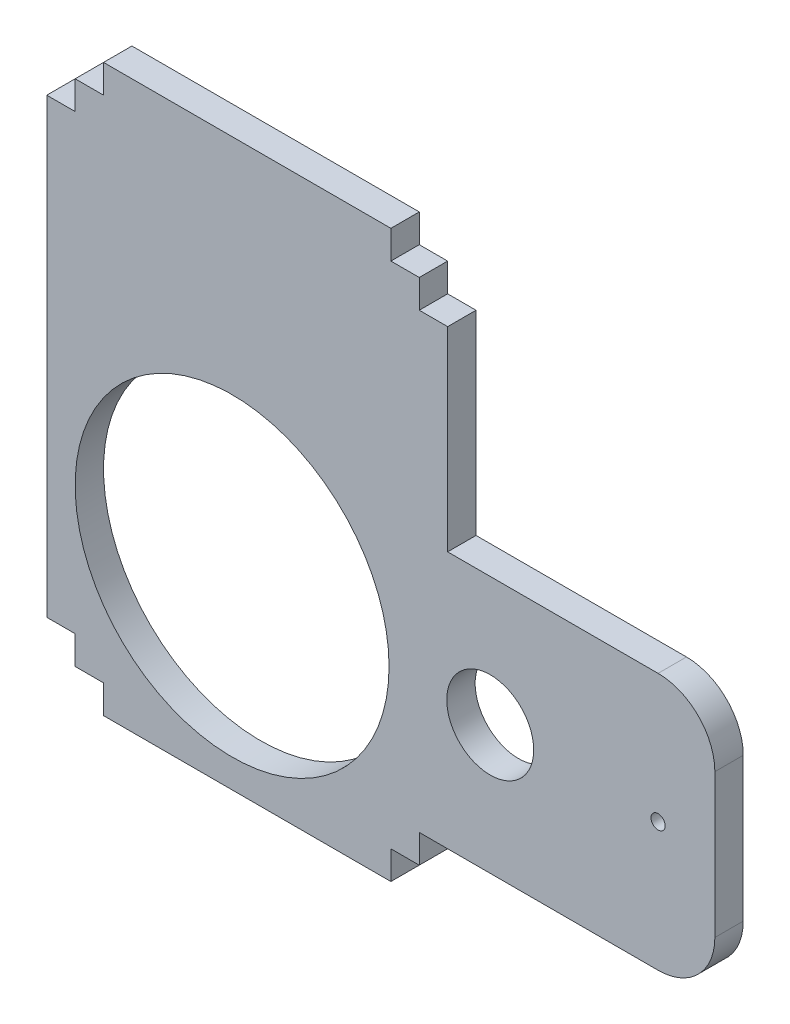
ISO-10303-21;
HEADER;
FILE_DESCRIPTION(('STEP AP214'),'2;1');
FILE_NAME('part.step','',(''),(''),'','','');
FILE_SCHEMA(('AUTOMOTIVE_DESIGN { 1 0 10303 214 1 1 1 1 }'));
ENDSEC;
DATA;
#1=APPLICATION_CONTEXT('core data for automotive mechanical design processes');
#2=APPLICATION_PROTOCOL_DEFINITION('international standard','automotive_design',2000,#1);
#3=PRODUCT_CONTEXT('',#1,'mechanical');
#4=PRODUCT('Part','Part','',(#3));
#5=PRODUCT_RELATED_PRODUCT_CATEGORY('part','',(#4));
#6=PRODUCT_DEFINITION_FORMATION('','',#4);
#7=PRODUCT_DEFINITION_CONTEXT('part definition',#1,'design');
#8=PRODUCT_DEFINITION('design','',#6,#7);
#9=PRODUCT_DEFINITION_SHAPE('','',#8);
#10=(LENGTH_UNIT() NAMED_UNIT(*) SI_UNIT(.MILLI.,.METRE.));
#11=(NAMED_UNIT(*) PLANE_ANGLE_UNIT() SI_UNIT($,.RADIAN.));
#12=(NAMED_UNIT(*) SI_UNIT($,.STERADIAN.) SOLID_ANGLE_UNIT());
#13=UNCERTAINTY_MEASURE_WITH_UNIT(LENGTH_MEASURE(1.E-05),#10,'distance_accuracy_value','');
#14=(GEOMETRIC_REPRESENTATION_CONTEXT(3) GLOBAL_UNCERTAINTY_ASSIGNED_CONTEXT((#13)) GLOBAL_UNIT_ASSIGNED_CONTEXT((#10,
#11,#12)) REPRESENTATION_CONTEXT('',''));
#15=CARTESIAN_POINT('',(0.,0.,0.));
#16=DIRECTION('',(0.,0.,1.));
#17=DIRECTION('',(1.,0.,0.));
#18=AXIS2_PLACEMENT_3D('',#15,#16,#17);
#19=CARTESIAN_POINT('',(-35.1155,-35.1155,-6.35));
#20=DIRECTION('',(-1.,0.,0.));
#21=DIRECTION('',(0.,0.,1.));
#22=AXIS2_PLACEMENT_3D('',#19,#20,#21);
#23=PLANE('',#22);
#24=DIRECTION('',(0.,-1.,0.));
#25=VECTOR('',#24,1.);
#26=CARTESIAN_POINT('',(-35.1155,-35.1155,0.));
#27=LINE('',#26,#25);
#28=CARTESIAN_POINT('',(-35.1155,-28.7655,0.));
#29=VERTEX_POINT('',#28);
#30=CARTESIAN_POINT('',(-35.1155,-35.1155,0.));
#31=VERTEX_POINT('',#30);
#32=EDGE_CURVE('E224',#29,#31,#27,.T.);
#33=ORIENTED_EDGE('',*,*,#32,.F.);
#34=DIRECTION('',(0.,0.,1.));
#35=VECTOR('',#34,1.);
#36=CARTESIAN_POINT('',(-35.1155,-28.7655,-6.35));
#37=LINE('',#36,#35);
#38=CARTESIAN_POINT('',(-35.1155,-28.7655,-6.35));
#39=VERTEX_POINT('',#38);
#40=EDGE_CURVE('E11',#39,#29,#37,.T.);
#41=ORIENTED_EDGE('',*,*,#40,.F.);
#42=DIRECTION('',(0.,-1.,0.));
#43=VECTOR('',#42,1.);
#44=CARTESIAN_POINT('',(-35.1155,-35.1155,-6.35));
#45=LINE('',#44,#43);
#46=CARTESIAN_POINT('',(-35.1155,-35.1155,-6.35));
#47=VERTEX_POINT('',#46);
#48=EDGE_CURVE('E293',#39,#47,#45,.T.);
#49=ORIENTED_EDGE('',*,*,#48,.T.);
#50=DIRECTION('',(0.,0.,1.));
#51=VECTOR('',#50,1.);
#52=CARTESIAN_POINT('',(-35.1155,-35.1155,-6.35));
#53=LINE('',#52,#51);
#54=EDGE_CURVE('E34',#47,#31,#53,.T.);
#55=ORIENTED_EDGE('',*,*,#54,.T.);
#56=EDGE_LOOP('',(#33,#41,#49,#55));
#57=FACE_BOUND('',#56,.T.);
#58=ADVANCED_FACE('F31',(#57),#23,.T.);
#59=CARTESIAN_POINT('',(-35.1155,-28.7655,-6.35));
#60=DIRECTION('',(0.,-1.,0.));
#61=DIRECTION('',(0.,0.,-1.));
#62=AXIS2_PLACEMENT_3D('',#59,#60,#61);
#63=PLANE('',#62);
#64=DIRECTION('',(1.,0.,0.));
#65=VECTOR('',#64,1.);
#66=CARTESIAN_POINT('',(-35.1155,-28.7655,0.));
#67=LINE('',#66,#65);
#68=CARTESIAN_POINT('',(-41.4655,-28.7655,0.));
#69=VERTEX_POINT('',#68);
#70=EDGE_CURVE('E291',#69,#29,#67,.T.);
#71=ORIENTED_EDGE('',*,*,#70,.F.);
#72=DIRECTION('',(0.,0.,1.));
#73=VECTOR('',#72,1.);
#74=CARTESIAN_POINT('',(-41.4655,-28.7655,-6.35));
#75=LINE('',#74,#73);
#76=CARTESIAN_POINT('',(-41.4655,-28.7655,-6.35));
#77=VERTEX_POINT('',#76);
#78=EDGE_CURVE('E40',#77,#69,#75,.T.);
#79=ORIENTED_EDGE('',*,*,#78,.F.);
#80=DIRECTION('',(1.,0.,0.));
#81=VECTOR('',#80,1.);
#82=CARTESIAN_POINT('',(-35.1155,-28.7655,-6.35));
#83=LINE('',#82,#81);
#84=EDGE_CURVE('E214',#77,#39,#83,.T.);
#85=ORIENTED_EDGE('',*,*,#84,.T.);
#86=ORIENTED_EDGE('',*,*,#40,.T.);
#87=EDGE_LOOP('',(#71,#79,#85,#86));
#88=FACE_BOUND('',#87,.T.);
#89=ADVANCED_FACE('F337',(#88),#63,.T.);
#90=CARTESIAN_POINT('',(-41.4655,-28.7655,-6.35));
#91=DIRECTION('',(-1.,0.,0.));
#92=DIRECTION('',(0.,0.,1.));
#93=AXIS2_PLACEMENT_3D('',#90,#91,#92);
#94=PLANE('',#93);
#95=DIRECTION('',(0.,-1.,0.));
#96=VECTOR('',#95,1.);
#97=CARTESIAN_POINT('',(-41.4655,-28.7655,0.));
#98=LINE('',#97,#96);
#99=CARTESIAN_POINT('',(-41.4655,72.4027,0.));
#100=VERTEX_POINT('',#99);
#101=EDGE_CURVE('E201',#100,#69,#98,.T.);
#102=ORIENTED_EDGE('',*,*,#101,.F.);
#103=DIRECTION('',(0.,0.,1.));
#104=VECTOR('',#103,1.);
#105=CARTESIAN_POINT('',(-41.4655,72.4027,-6.35));
#106=LINE('',#105,#104);
#107=CARTESIAN_POINT('',(-41.4655,72.4027,-6.35));
#108=VERTEX_POINT('',#107);
#109=EDGE_CURVE('E196',#108,#100,#106,.T.);
#110=ORIENTED_EDGE('',*,*,#109,.F.);
#111=DIRECTION('',(0.,-1.,0.));
#112=VECTOR('',#111,1.);
#113=CARTESIAN_POINT('',(-41.4655,-28.7655,-6.35));
#114=LINE('',#113,#112);
#115=EDGE_CURVE('E199',#108,#77,#114,.T.);
#116=ORIENTED_EDGE('',*,*,#115,.T.);
#117=ORIENTED_EDGE('',*,*,#78,.T.);
#118=EDGE_LOOP('',(#102,#110,#116,#117));
#119=FACE_BOUND('',#118,.T.);
#120=ADVANCED_FACE('F198',(#119),#94,.T.);
#121=CARTESIAN_POINT('',(-35.1155,72.4027,-6.35));
#122=DIRECTION('',(0.,1.,0.));
#123=DIRECTION('',(0.,0.,1.));
#124=AXIS2_PLACEMENT_3D('',#121,#122,#123);
#125=PLANE('',#124);
#126=DIRECTION('',(-1.,0.,0.));
#127=VECTOR('',#126,1.);
#128=CARTESIAN_POINT('',(-35.1155,72.4027,0.));
#129=LINE('',#128,#127);
#130=CARTESIAN_POINT('',(-35.1155,72.4027,0.));
#131=VERTEX_POINT('',#130);
#132=EDGE_CURVE('E288',#131,#100,#129,.T.);
#133=ORIENTED_EDGE('',*,*,#132,.F.);
#134=DIRECTION('',(0.,0.,1.));
#135=VECTOR('',#134,1.);
#136=CARTESIAN_POINT('',(-35.1155,72.4027,-6.35));
#137=LINE('',#136,#135);
#138=CARTESIAN_POINT('',(-35.1155,72.4027,-6.35));
#139=VERTEX_POINT('',#138);
#140=EDGE_CURVE('E206',#139,#131,#137,.T.);
#141=ORIENTED_EDGE('',*,*,#140,.F.);
#142=DIRECTION('',(-1.,0.,0.));
#143=VECTOR('',#142,1.);
#144=CARTESIAN_POINT('',(-35.1155,72.4027,-6.35));
#145=LINE('',#144,#143);
#146=EDGE_CURVE('E212',#139,#108,#145,.T.);
#147=ORIENTED_EDGE('',*,*,#146,.T.);
#148=ORIENTED_EDGE('',*,*,#109,.T.);
#149=EDGE_LOOP('',(#133,#141,#147,#148));
#150=FACE_BOUND('',#149,.T.);
#151=ADVANCED_FACE('F216',(#150),#125,.T.);
#152=CARTESIAN_POINT('',(-35.1155,72.4027,-6.35));
#153=DIRECTION('',(-1.,0.,0.));
#154=DIRECTION('',(0.,0.,1.));
#155=AXIS2_PLACEMENT_3D('',#152,#153,#154);
#156=PLANE('',#155);
#157=DIRECTION('',(0.,-1.,0.));
#158=VECTOR('',#157,1.);
#159=CARTESIAN_POINT('',(-35.1155,72.4027,0.));
#160=LINE('',#159,#158);
#161=CARTESIAN_POINT('',(-35.1155,78.7527,0.));
#162=VERTEX_POINT('',#161);
#163=EDGE_CURVE('E285',#162,#131,#160,.T.);
#164=ORIENTED_EDGE('',*,*,#163,.F.);
#165=DIRECTION('',(0.,0.,1.));
#166=VECTOR('',#165,1.);
#167=CARTESIAN_POINT('',(-35.1155,78.7527,-6.35));
#168=LINE('',#167,#166);
#169=CARTESIAN_POINT('',(-35.1155,78.7527,-6.35));
#170=VERTEX_POINT('',#169);
#171=EDGE_CURVE('E297',#170,#162,#168,.T.);
#172=ORIENTED_EDGE('',*,*,#171,.F.);
#173=DIRECTION('',(0.,-1.,0.));
#174=VECTOR('',#173,1.);
#175=CARTESIAN_POINT('',(-35.1155,72.4027,-6.35));
#176=LINE('',#175,#174);
#177=EDGE_CURVE('E217',#170,#139,#176,.T.);
#178=ORIENTED_EDGE('',*,*,#177,.T.);
#179=ORIENTED_EDGE('',*,*,#140,.T.);
#180=EDGE_LOOP('',(#164,#172,#178,#179));
#181=FACE_BOUND('',#180,.T.);
#182=ADVANCED_FACE('F350',(#181),#156,.T.);
#183=CARTESIAN_POINT('',(-35.1155,78.7527,-6.35));
#184=DIRECTION('',(0.,1.,0.));
#185=DIRECTION('',(-1.,0.,0.));
#186=AXIS2_PLACEMENT_3D('',#183,#184,#185);
#187=PLANE('',#186);
#188=DIRECTION('',(-1.,0.,0.));
#189=VECTOR('',#188,1.);
#190=CARTESIAN_POINT('',(-35.1155,78.7527,0.));
#191=LINE('',#190,#189);
#192=CARTESIAN_POINT('',(-28.7655,78.7527,0.));
#193=VERTEX_POINT('',#192);
#194=EDGE_CURVE('E282',#193,#162,#191,.T.);
#195=ORIENTED_EDGE('',*,*,#194,.F.);
#196=DIRECTION('',(0.,0.,1.));
#197=VECTOR('',#196,1.);
#198=CARTESIAN_POINT('',(-28.7655,78.7527,-6.35));
#199=LINE('',#198,#197);
#200=CARTESIAN_POINT('',(-28.7655,78.7527,-6.35));
#201=VERTEX_POINT('',#200);
#202=EDGE_CURVE('E299',#201,#193,#199,.T.);
#203=ORIENTED_EDGE('',*,*,#202,.F.);
#204=DIRECTION('',(-1.,0.,0.));
#205=VECTOR('',#204,1.);
#206=CARTESIAN_POINT('',(-35.1155,78.7527,-6.35));
#207=LINE('',#206,#205);
#208=EDGE_CURVE('E219',#201,#170,#207,.T.);
#209=ORIENTED_EDGE('',*,*,#208,.T.);
#210=ORIENTED_EDGE('',*,*,#171,.T.);
#211=EDGE_LOOP('',(#195,#203,#209,#210));
#212=FACE_BOUND('',#211,.T.);
#213=ADVANCED_FACE('F353',(#212),#187,.T.);
#214=CARTESIAN_POINT('',(-28.7655,78.7527,-6.35));
#215=DIRECTION('',(-1.,0.,0.));
#216=DIRECTION('',(0.,-1.,0.));
#217=AXIS2_PLACEMENT_3D('',#214,#215,#216);
#218=PLANE('',#217);
#219=DIRECTION('',(0.,-1.,0.));
#220=VECTOR('',#219,1.);
#221=CARTESIAN_POINT('',(-28.7655,78.7527,0.));
#222=LINE('',#221,#220);
#223=CARTESIAN_POINT('',(-28.7655,85.1027,0.));
#224=VERTEX_POINT('',#223);
#225=EDGE_CURVE('E279',#224,#193,#222,.T.);
#226=ORIENTED_EDGE('',*,*,#225,.F.);
#227=DIRECTION('',(0.,0.,1.));
#228=VECTOR('',#227,1.);
#229=CARTESIAN_POINT('',(-28.7655,85.1027,-6.35));
#230=LINE('',#229,#228);
#231=CARTESIAN_POINT('',(-28.7655,85.1027,-6.35));
#232=VERTEX_POINT('',#231);
#233=EDGE_CURVE('E301',#232,#224,#230,.T.);
#234=ORIENTED_EDGE('',*,*,#233,.F.);
#235=DIRECTION('',(0.,-1.,0.));
#236=VECTOR('',#235,1.);
#237=CARTESIAN_POINT('',(-28.7655,78.7527,-6.35));
#238=LINE('',#237,#236);
#239=EDGE_CURVE('E521',#232,#201,#238,.T.);
#240=ORIENTED_EDGE('',*,*,#239,.T.);
#241=ORIENTED_EDGE('',*,*,#202,.T.);
#242=EDGE_LOOP('',(#226,#234,#240,#241));
#243=FACE_BOUND('',#242,.T.);
#244=ADVANCED_FACE('F357',(#243),#218,.T.);
#245=CARTESIAN_POINT('',(35.5219,85.1027,-6.35));
#246=DIRECTION('',(0.,1.,0.));
#247=DIRECTION('',(-1.,0.,0.));
#248=AXIS2_PLACEMENT_3D('',#245,#246,#247);
#249=PLANE('',#248);
#250=DIRECTION('',(-1.,0.,0.));
#251=VECTOR('',#250,1.);
#252=CARTESIAN_POINT('',(35.5219,85.1027,0.));
#253=LINE('',#252,#251);
#254=CARTESIAN_POINT('',(35.5219,85.1027,0.));
#255=VERTEX_POINT('',#254);
#256=EDGE_CURVE('E276',#255,#224,#253,.T.);
#257=ORIENTED_EDGE('',*,*,#256,.F.);
#258=DIRECTION('',(0.,0.,1.));
#259=VECTOR('',#258,1.);
#260=CARTESIAN_POINT('',(35.5219,85.1027,-6.35));
#261=LINE('',#260,#259);
#262=CARTESIAN_POINT('',(35.5219,85.1027,-6.35));
#263=VERTEX_POINT('',#262);
#264=EDGE_CURVE('E303',#263,#255,#261,.T.);
#265=ORIENTED_EDGE('',*,*,#264,.F.);
#266=DIRECTION('',(-1.,0.,0.));
#267=VECTOR('',#266,1.);
#268=CARTESIAN_POINT('',(35.5219,85.1027,-6.35));
#269=LINE('',#268,#267);
#270=EDGE_CURVE('E518',#263,#232,#269,.T.);
#271=ORIENTED_EDGE('',*,*,#270,.T.);
#272=ORIENTED_EDGE('',*,*,#233,.T.);
#273=EDGE_LOOP('',(#257,#265,#271,#272));
#274=FACE_BOUND('',#273,.T.);
#275=ADVANCED_FACE('F361',(#274),#249,.T.);
#276=CARTESIAN_POINT('',(35.5219,78.7527,-6.35));
#277=DIRECTION('',(1.,0.,0.));
#278=DIRECTION('',(0.,0.,-1.));
#279=AXIS2_PLACEMENT_3D('',#276,#277,#278);
#280=PLANE('',#279);
#281=DIRECTION('',(0.,1.,0.));
#282=VECTOR('',#281,1.);
#283=CARTESIAN_POINT('',(35.5219,78.7527,0.));
#284=LINE('',#283,#282);
#285=CARTESIAN_POINT('',(35.5219,78.7527,0.));
#286=VERTEX_POINT('',#285);
#287=EDGE_CURVE('E273',#286,#255,#284,.T.);
#288=ORIENTED_EDGE('',*,*,#287,.F.);
#289=DIRECTION('',(0.,0.,1.));
#290=VECTOR('',#289,1.);
#291=CARTESIAN_POINT('',(35.5219,78.7527,-6.35));
#292=LINE('',#291,#290);
#293=CARTESIAN_POINT('',(35.5219,78.7527,-6.35));
#294=VERTEX_POINT('',#293);
#295=EDGE_CURVE('E305',#294,#286,#292,.T.);
#296=ORIENTED_EDGE('',*,*,#295,.F.);
#297=DIRECTION('',(0.,1.,0.));
#298=VECTOR('',#297,1.);
#299=CARTESIAN_POINT('',(35.5219,78.7527,-6.35));
#300=LINE('',#299,#298);
#301=EDGE_CURVE('E515',#294,#263,#300,.T.);
#302=ORIENTED_EDGE('',*,*,#301,.T.);
#303=ORIENTED_EDGE('',*,*,#264,.T.);
#304=EDGE_LOOP('',(#288,#296,#302,#303));
#305=FACE_BOUND('',#304,.T.);
#306=ADVANCED_FACE('F365',(#305),#280,.T.);
#307=CARTESIAN_POINT('',(35.5219,78.7527,-6.35));
#308=DIRECTION('',(0.,1.,0.));
#309=DIRECTION('',(0.,0.,1.));
#310=AXIS2_PLACEMENT_3D('',#307,#308,#309);
#311=PLANE('',#310);
#312=DIRECTION('',(-1.,0.,0.));
#313=VECTOR('',#312,1.);
#314=CARTESIAN_POINT('',(35.5219,78.7527,0.));
#315=LINE('',#314,#313);
#316=CARTESIAN_POINT('',(41.8719,78.7527,0.));
#317=VERTEX_POINT('',#316);
#318=EDGE_CURVE('E270',#317,#286,#315,.T.);
#319=ORIENTED_EDGE('',*,*,#318,.F.);
#320=DIRECTION('',(0.,0.,1.));
#321=VECTOR('',#320,1.);
#322=CARTESIAN_POINT('',(41.8719,78.7527,-6.35));
#323=LINE('',#322,#321);
#324=CARTESIAN_POINT('',(41.8719,78.7527,-6.35));
#325=VERTEX_POINT('',#324);
#326=EDGE_CURVE('E307',#325,#317,#323,.T.);
#327=ORIENTED_EDGE('',*,*,#326,.F.);
#328=DIRECTION('',(-1.,0.,0.));
#329=VECTOR('',#328,1.);
#330=CARTESIAN_POINT('',(35.5219,78.7527,-6.35));
#331=LINE('',#330,#329);
#332=EDGE_CURVE('E512',#325,#294,#331,.T.);
#333=ORIENTED_EDGE('',*,*,#332,.T.);
#334=ORIENTED_EDGE('',*,*,#295,.T.);
#335=EDGE_LOOP('',(#319,#327,#333,#334));
#336=FACE_BOUND('',#335,.T.);
#337=ADVANCED_FACE('F369',(#336),#311,.T.);
#338=CARTESIAN_POINT('',(41.8719,72.4027,-6.35));
#339=DIRECTION('',(1.,0.,0.));
#340=DIRECTION('',(0.,0.,-1.));
#341=AXIS2_PLACEMENT_3D('',#338,#339,#340);
#342=PLANE('',#341);
#343=DIRECTION('',(0.,1.,0.));
#344=VECTOR('',#343,1.);
#345=CARTESIAN_POINT('',(41.8719,72.4027,0.));
#346=LINE('',#345,#344);
#347=CARTESIAN_POINT('',(41.8719,72.4027,0.));
#348=VERTEX_POINT('',#347);
#349=EDGE_CURVE('E267',#348,#317,#346,.T.);
#350=ORIENTED_EDGE('',*,*,#349,.F.);
#351=DIRECTION('',(0.,0.,1.));
#352=VECTOR('',#351,1.);
#353=CARTESIAN_POINT('',(41.8719,72.4027,-6.35));
#354=LINE('',#353,#352);
#355=CARTESIAN_POINT('',(41.8719,72.4027,-6.35));
#356=VERTEX_POINT('',#355);
#357=EDGE_CURVE('E309',#356,#348,#354,.T.);
#358=ORIENTED_EDGE('',*,*,#357,.F.);
#359=DIRECTION('',(0.,1.,0.));
#360=VECTOR('',#359,1.);
#361=CARTESIAN_POINT('',(41.8719,72.4027,-6.35));
#362=LINE('',#361,#360);
#363=EDGE_CURVE('E509',#356,#325,#362,.T.);
#364=ORIENTED_EDGE('',*,*,#363,.T.);
#365=ORIENTED_EDGE('',*,*,#326,.T.);
#366=EDGE_LOOP('',(#350,#358,#364,#365));
#367=FACE_BOUND('',#366,.T.);
#368=ADVANCED_FACE('F373',(#367),#342,.T.);
#369=CARTESIAN_POINT('',(41.8719,72.4027,-6.35));
#370=DIRECTION('',(0.,1.,0.));
#371=DIRECTION('',(-1.,0.,0.));
#372=AXIS2_PLACEMENT_3D('',#369,#370,#371);
#373=PLANE('',#372);
#374=DIRECTION('',(-1.,0.,0.));
#375=VECTOR('',#374,1.);
#376=CARTESIAN_POINT('',(41.8719,72.4027,0.));
#377=LINE('',#376,#375);
#378=CARTESIAN_POINT('',(48.2219,72.4027,0.));
#379=VERTEX_POINT('',#378);
#380=EDGE_CURVE('E264',#379,#348,#377,.T.);
#381=ORIENTED_EDGE('',*,*,#380,.F.);
#382=DIRECTION('',(0.,0.,1.));
#383=VECTOR('',#382,1.);
#384=CARTESIAN_POINT('',(48.2219,72.4027,-6.35));
#385=LINE('',#384,#383);
#386=CARTESIAN_POINT('',(48.2219,72.4027,-6.35));
#387=VERTEX_POINT('',#386);
#388=EDGE_CURVE('E311',#387,#379,#385,.T.);
#389=ORIENTED_EDGE('',*,*,#388,.F.);
#390=DIRECTION('',(-1.,0.,0.));
#391=VECTOR('',#390,1.);
#392=CARTESIAN_POINT('',(41.8719,72.4027,-6.35));
#393=LINE('',#392,#391);
#394=EDGE_CURVE('E506',#387,#356,#393,.T.);
#395=ORIENTED_EDGE('',*,*,#394,.T.);
#396=ORIENTED_EDGE('',*,*,#357,.T.);
#397=EDGE_LOOP('',(#381,#389,#395,#396));
#398=FACE_BOUND('',#397,.T.);
#399=ADVANCED_FACE('F377',(#398),#373,.T.);
#400=CARTESIAN_POINT('',(48.2219,72.4027,-6.35));
#401=DIRECTION('',(1.,0.,0.));
#402=DIRECTION('',(0.,1.,0.));
#403=AXIS2_PLACEMENT_3D('',#400,#401,#402);
#404=PLANE('',#403);
#405=DIRECTION('',(0.,1.,0.));
#406=VECTOR('',#405,1.);
#407=CARTESIAN_POINT('',(48.2219,72.4027,0.));
#408=LINE('',#407,#406);
#409=CARTESIAN_POINT('',(48.2219,28.7655,0.));
#410=VERTEX_POINT('',#409);
#411=EDGE_CURVE('E261',#410,#379,#408,.T.);
#412=ORIENTED_EDGE('',*,*,#411,.F.);
#413=DIRECTION('',(0.,0.,1.));
#414=VECTOR('',#413,1.);
#415=CARTESIAN_POINT('',(48.2219,28.7655,-6.35));
#416=LINE('',#415,#414);
#417=CARTESIAN_POINT('',(48.2219,28.7655,-6.35));
#418=VERTEX_POINT('',#417);
#419=EDGE_CURVE('E313',#418,#410,#416,.T.);
#420=ORIENTED_EDGE('',*,*,#419,.F.);
#421=DIRECTION('',(0.,1.,0.));
#422=VECTOR('',#421,1.);
#423=CARTESIAN_POINT('',(48.2219,72.4027,-6.35));
#424=LINE('',#423,#422);
#425=EDGE_CURVE('E503',#418,#387,#424,.T.);
#426=ORIENTED_EDGE('',*,*,#425,.T.);
#427=ORIENTED_EDGE('',*,*,#388,.T.);
#428=EDGE_LOOP('',(#412,#420,#426,#427));
#429=FACE_BOUND('',#428,.T.);
#430=ADVANCED_FACE('F381',(#429),#404,.T.);
#431=CARTESIAN_POINT('',(48.2219,28.7655,-6.35));
#432=DIRECTION('',(0.,1.,0.));
#433=DIRECTION('',(-1.,0.,0.));
#434=AXIS2_PLACEMENT_3D('',#431,#432,#433);
#435=PLANE('',#434);
#436=DIRECTION('',(-1.,0.,0.));
#437=VECTOR('',#436,1.);
#438=CARTESIAN_POINT('',(48.2219,28.7655,0.));
#439=LINE('',#438,#437);
#440=CARTESIAN_POINT('',(95.3007999999999,28.7655000000001,0.));
#441=VERTEX_POINT('',#440);
#442=EDGE_CURVE('E258',#441,#410,#439,.T.);
#443=ORIENTED_EDGE('',*,*,#442,.F.);
#444=DIRECTION('',(0.,0.,1.));
#445=VECTOR('',#444,1.);
#446=CARTESIAN_POINT('',(95.3007999999999,28.7655000000001,-6.35));
#447=LINE('',#446,#445);
#448=CARTESIAN_POINT('',(95.3007999999999,28.7655000000001,-6.35));
#449=VERTEX_POINT('',#448);
#450=EDGE_CURVE('E315',#449,#441,#447,.T.);
#451=ORIENTED_EDGE('',*,*,#450,.F.);
#452=DIRECTION('',(-1.,0.,0.));
#453=VECTOR('',#452,1.);
#454=CARTESIAN_POINT('',(48.2219,28.7655,-6.35));
#455=LINE('',#454,#453);
#456=EDGE_CURVE('E500',#449,#418,#455,.T.);
#457=ORIENTED_EDGE('',*,*,#456,.T.);
#458=ORIENTED_EDGE('',*,*,#419,.T.);
#459=EDGE_LOOP('',(#443,#451,#457,#458));
#460=FACE_BOUND('',#459,.T.);
#461=ADVANCED_FACE('F385',(#460),#435,.T.);
#462=CARTESIAN_POINT('',(95.3008,16.0655000000001,-6.35));
#463=DIRECTION('',(0.,0.,1.));
#464=DIRECTION('',(1.,0.,0.));
#465=AXIS2_PLACEMENT_3D('',#462,#463,#464);
#466=CYLINDRICAL_SURFACE('',#465,12.7);
#467=CARTESIAN_POINT('',(95.3008,16.0655000000001,0.));
#468=DIRECTION('',(0.,0.,1.));
#469=DIRECTION('',(-1.,0.,0.));
#470=AXIS2_PLACEMENT_3D('',#467,#468,#469);
#471=CIRCLE('',#470,12.7);
#472=CARTESIAN_POINT('',(108.0008,16.0655,0.));
#473=VERTEX_POINT('',#472);
#474=EDGE_CURVE('E255',#473,#441,#471,.T.);
#475=ORIENTED_EDGE('',*,*,#474,.F.);
#476=DIRECTION('',(0.,0.,1.));
#477=VECTOR('',#476,1.);
#478=CARTESIAN_POINT('',(108.0008,16.0655,-6.35));
#479=LINE('',#478,#477);
#480=CARTESIAN_POINT('',(108.0008,16.0655,-6.35));
#481=VERTEX_POINT('',#480);
#482=EDGE_CURVE('E317',#481,#473,#479,.T.);
#483=ORIENTED_EDGE('',*,*,#482,.F.);
#484=CARTESIAN_POINT('',(95.3008,16.0655000000001,-6.35));
#485=DIRECTION('',(0.,0.,1.));
#486=DIRECTION('',(-1.,0.,0.));
#487=AXIS2_PLACEMENT_3D('',#484,#485,#486);
#488=CIRCLE('',#487,12.7);
#489=EDGE_CURVE('E497',#481,#449,#488,.T.);
#490=ORIENTED_EDGE('',*,*,#489,.T.);
#491=ORIENTED_EDGE('',*,*,#450,.T.);
#492=EDGE_LOOP('',(#475,#483,#490,#491));
#493=FACE_BOUND('',#492,.T.);
#494=ADVANCED_FACE('F389',(#493),#466,.T.);
#495=CARTESIAN_POINT('',(108.0008,-16.0654999999999,-6.35));
#496=DIRECTION('',(1.,0.,0.));
#497=DIRECTION('',(0.,0.,-1.));
#498=AXIS2_PLACEMENT_3D('',#495,#496,#497);
#499=PLANE('',#498);
#500=DIRECTION('',(0.,1.,0.));
#501=VECTOR('',#500,1.);
#502=CARTESIAN_POINT('',(108.0008,-16.0654999999999,0.));
#503=LINE('',#502,#501);
#504=CARTESIAN_POINT('',(108.0008,-16.0654999999999,0.));
#505=VERTEX_POINT('',#504);
#506=EDGE_CURVE('E252',#505,#473,#503,.T.);
#507=ORIENTED_EDGE('',*,*,#506,.F.);
#508=DIRECTION('',(0.,0.,1.));
#509=VECTOR('',#508,1.);
#510=CARTESIAN_POINT('',(108.0008,-16.0654999999999,-6.35));
#511=LINE('',#510,#509);
#512=CARTESIAN_POINT('',(108.0008,-16.0654999999999,-6.35));
#513=VERTEX_POINT('',#512);
#514=EDGE_CURVE('E319',#513,#505,#511,.T.);
#515=ORIENTED_EDGE('',*,*,#514,.F.);
#516=DIRECTION('',(0.,1.,0.));
#517=VECTOR('',#516,1.);
#518=CARTESIAN_POINT('',(108.0008,-16.0654999999999,-6.35));
#519=LINE('',#518,#517);
#520=EDGE_CURVE('E494',#513,#481,#519,.T.);
#521=ORIENTED_EDGE('',*,*,#520,.T.);
#522=ORIENTED_EDGE('',*,*,#482,.T.);
#523=EDGE_LOOP('',(#507,#515,#521,#522));
#524=FACE_BOUND('',#523,.T.);
#525=ADVANCED_FACE('F393',(#524),#499,.T.);
#526=CARTESIAN_POINT('',(95.3008,-16.0655,-6.35));
#527=DIRECTION('',(0.,0.,1.));
#528=DIRECTION('',(1.,0.,0.));
#529=AXIS2_PLACEMENT_3D('',#526,#527,#528);
#530=CYLINDRICAL_SURFACE('',#529,12.7);
#531=CARTESIAN_POINT('',(95.3008,-16.0655,0.));
#532=DIRECTION('',(0.,0.,1.));
#533=DIRECTION('',(1.,0.,0.));
#534=AXIS2_PLACEMENT_3D('',#531,#532,#533);
#535=CIRCLE('',#534,12.7);
#536=CARTESIAN_POINT('',(95.3007999999999,-28.7655,0.));
#537=VERTEX_POINT('',#536);
#538=EDGE_CURVE('E249',#537,#505,#535,.T.);
#539=ORIENTED_EDGE('',*,*,#538,.F.);
#540=DIRECTION('',(0.,0.,1.));
#541=VECTOR('',#540,1.);
#542=CARTESIAN_POINT('',(95.3007999999999,-28.7655,-6.35));
#543=LINE('',#542,#541);
#544=CARTESIAN_POINT('',(95.3007999999999,-28.7655,-6.35));
#545=VERTEX_POINT('',#544);
#546=EDGE_CURVE('E321',#545,#537,#543,.T.);
#547=ORIENTED_EDGE('',*,*,#546,.F.);
#548=CARTESIAN_POINT('',(95.3008,-16.0655,-6.35));
#549=DIRECTION('',(0.,0.,1.));
#550=DIRECTION('',(1.,0.,0.));
#551=AXIS2_PLACEMENT_3D('',#548,#549,#550);
#552=CIRCLE('',#551,12.7);
#553=EDGE_CURVE('E491',#545,#513,#552,.T.);
#554=ORIENTED_EDGE('',*,*,#553,.T.);
#555=ORIENTED_EDGE('',*,*,#514,.T.);
#556=EDGE_LOOP('',(#539,#547,#554,#555));
#557=FACE_BOUND('',#556,.T.);
#558=ADVANCED_FACE('F397',(#557),#530,.T.);
#559=CARTESIAN_POINT('',(41.8719,-28.7655,-6.35));
#560=DIRECTION('',(0.,-1.,0.));
#561=DIRECTION('',(1.,0.,0.));
#562=AXIS2_PLACEMENT_3D('',#559,#560,#561);
#563=PLANE('',#562);
#564=DIRECTION('',(1.,0.,0.));
#565=VECTOR('',#564,1.);
#566=CARTESIAN_POINT('',(41.8719,-28.7655,0.));
#567=LINE('',#566,#565);
#568=CARTESIAN_POINT('',(41.8719,-28.7655,0.));
#569=VERTEX_POINT('',#568);
#570=EDGE_CURVE('E246',#569,#537,#567,.T.);
#571=ORIENTED_EDGE('',*,*,#570,.F.);
#572=DIRECTION('',(0.,0.,1.));
#573=VECTOR('',#572,1.);
#574=CARTESIAN_POINT('',(41.8719,-28.7655,-6.35));
#575=LINE('',#574,#573);
#576=CARTESIAN_POINT('',(41.8719,-28.7655,-6.35));
#577=VERTEX_POINT('',#576);
#578=EDGE_CURVE('E323',#577,#569,#575,.T.);
#579=ORIENTED_EDGE('',*,*,#578,.F.);
#580=DIRECTION('',(1.,0.,0.));
#581=VECTOR('',#580,1.);
#582=CARTESIAN_POINT('',(41.8719,-28.7655,-6.35));
#583=LINE('',#582,#581);
#584=EDGE_CURVE('E488',#577,#545,#583,.T.);
#585=ORIENTED_EDGE('',*,*,#584,.T.);
#586=ORIENTED_EDGE('',*,*,#546,.T.);
#587=EDGE_LOOP('',(#571,#579,#585,#586));
#588=FACE_BOUND('',#587,.T.);
#589=ADVANCED_FACE('F401',(#588),#563,.T.);
#590=CARTESIAN_POINT('',(41.8719,-35.1155,-6.35));
#591=DIRECTION('',(1.,0.,0.));
#592=DIRECTION('',(0.,0.,-1.));
#593=AXIS2_PLACEMENT_3D('',#590,#591,#592);
#594=PLANE('',#593);
#595=DIRECTION('',(0.,1.,0.));
#596=VECTOR('',#595,1.);
#597=CARTESIAN_POINT('',(41.8719,-35.1155,0.));
#598=LINE('',#597,#596);
#599=CARTESIAN_POINT('',(41.8719,-35.1155,0.));
#600=VERTEX_POINT('',#599);
#601=EDGE_CURVE('E243',#600,#569,#598,.T.);
#602=ORIENTED_EDGE('',*,*,#601,.F.);
#603=DIRECTION('',(0.,0.,1.));
#604=VECTOR('',#603,1.);
#605=CARTESIAN_POINT('',(41.8719,-35.1155,-6.35));
#606=LINE('',#605,#604);
#607=CARTESIAN_POINT('',(41.8719,-35.1155,-6.35));
#608=VERTEX_POINT('',#607);
#609=EDGE_CURVE('E325',#608,#600,#606,.T.);
#610=ORIENTED_EDGE('',*,*,#609,.F.);
#611=DIRECTION('',(0.,1.,0.));
#612=VECTOR('',#611,1.);
#613=CARTESIAN_POINT('',(41.8719,-35.1155,-6.35));
#614=LINE('',#613,#612);
#615=EDGE_CURVE('E485',#608,#577,#614,.T.);
#616=ORIENTED_EDGE('',*,*,#615,.T.);
#617=ORIENTED_EDGE('',*,*,#578,.T.);
#618=EDGE_LOOP('',(#602,#610,#616,#617));
#619=FACE_BOUND('',#618,.T.);
#620=ADVANCED_FACE('F405',(#619),#594,.T.);
#621=CARTESIAN_POINT('',(35.5219,-35.1155,-6.35));
#622=DIRECTION('',(0.,-1.,0.));
#623=DIRECTION('',(0.,0.,-1.));
#624=AXIS2_PLACEMENT_3D('',#621,#622,#623);
#625=PLANE('',#624);
#626=DIRECTION('',(1.,0.,0.));
#627=VECTOR('',#626,1.);
#628=CARTESIAN_POINT('',(35.5219,-35.1155,0.));
#629=LINE('',#628,#627);
#630=CARTESIAN_POINT('',(35.5219,-35.1155,0.));
#631=VERTEX_POINT('',#630);
#632=EDGE_CURVE('E240',#631,#600,#629,.T.);
#633=ORIENTED_EDGE('',*,*,#632,.F.);
#634=DIRECTION('',(0.,0.,1.));
#635=VECTOR('',#634,1.);
#636=CARTESIAN_POINT('',(35.5219,-35.1155,-6.35));
#637=LINE('',#636,#635);
#638=CARTESIAN_POINT('',(35.5219,-35.1155,-6.35));
#639=VERTEX_POINT('',#638);
#640=EDGE_CURVE('E327',#639,#631,#637,.T.);
#641=ORIENTED_EDGE('',*,*,#640,.F.);
#642=DIRECTION('',(1.,0.,0.));
#643=VECTOR('',#642,1.);
#644=CARTESIAN_POINT('',(35.5219,-35.1155,-6.35));
#645=LINE('',#644,#643);
#646=EDGE_CURVE('E482',#639,#608,#645,.T.);
#647=ORIENTED_EDGE('',*,*,#646,.T.);
#648=ORIENTED_EDGE('',*,*,#609,.T.);
#649=EDGE_LOOP('',(#633,#641,#647,#648));
#650=FACE_BOUND('',#649,.T.);
#651=ADVANCED_FACE('F409',(#650),#625,.T.);
#652=CARTESIAN_POINT('',(35.5219,-35.1155,-6.35));
#653=DIRECTION('',(1.,0.,0.));
#654=DIRECTION('',(0.,0.,-1.));
#655=AXIS2_PLACEMENT_3D('',#652,#653,#654);
#656=PLANE('',#655);
#657=DIRECTION('',(0.,1.,0.));
#658=VECTOR('',#657,1.);
#659=CARTESIAN_POINT('',(35.5219,-35.1155,0.));
#660=LINE('',#659,#658);
#661=CARTESIAN_POINT('',(35.5219,-41.4655,0.));
#662=VERTEX_POINT('',#661);
#663=EDGE_CURVE('E237',#662,#631,#660,.T.);
#664=ORIENTED_EDGE('',*,*,#663,.F.);
#665=DIRECTION('',(0.,0.,1.));
#666=VECTOR('',#665,1.);
#667=CARTESIAN_POINT('',(35.5219,-41.4655,-6.35));
#668=LINE('',#667,#666);
#669=CARTESIAN_POINT('',(35.5219,-41.4655,-6.35));
#670=VERTEX_POINT('',#669);
#671=EDGE_CURVE('E329',#670,#662,#668,.T.);
#672=ORIENTED_EDGE('',*,*,#671,.F.);
#673=DIRECTION('',(0.,1.,0.));
#674=VECTOR('',#673,1.);
#675=CARTESIAN_POINT('',(35.5219,-35.1155,-6.35));
#676=LINE('',#675,#674);
#677=EDGE_CURVE('E479',#670,#639,#676,.T.);
#678=ORIENTED_EDGE('',*,*,#677,.T.);
#679=ORIENTED_EDGE('',*,*,#640,.T.);
#680=EDGE_LOOP('',(#664,#672,#678,#679));
#681=FACE_BOUND('',#680,.T.);
#682=ADVANCED_FACE('F413',(#681),#656,.T.);
#683=CARTESIAN_POINT('',(35.5219,-41.4655,-6.35));
#684=DIRECTION('',(0.,-1.,0.));
#685=DIRECTION('',(1.,0.,0.));
#686=AXIS2_PLACEMENT_3D('',#683,#684,#685);
#687=PLANE('',#686);
#688=DIRECTION('',(1.,0.,0.));
#689=VECTOR('',#688,1.);
#690=CARTESIAN_POINT('',(35.5219,-41.4655,0.));
#691=LINE('',#690,#689);
#692=CARTESIAN_POINT('',(-28.7655,-41.4655,0.));
#693=VERTEX_POINT('',#692);
#694=EDGE_CURVE('E234',#693,#662,#691,.T.);
#695=ORIENTED_EDGE('',*,*,#694,.F.);
#696=DIRECTION('',(0.,0.,1.));
#697=VECTOR('',#696,1.);
#698=CARTESIAN_POINT('',(-28.7655,-41.4655,-6.35));
#699=LINE('',#698,#697);
#700=CARTESIAN_POINT('',(-28.7655,-41.4655,-6.35));
#701=VERTEX_POINT('',#700);
#702=EDGE_CURVE('E331',#701,#693,#699,.T.);
#703=ORIENTED_EDGE('',*,*,#702,.F.);
#704=DIRECTION('',(1.,0.,0.));
#705=VECTOR('',#704,1.);
#706=CARTESIAN_POINT('',(35.5219,-41.4655,-6.35));
#707=LINE('',#706,#705);
#708=EDGE_CURVE('E476',#701,#670,#707,.T.);
#709=ORIENTED_EDGE('',*,*,#708,.T.);
#710=ORIENTED_EDGE('',*,*,#671,.T.);
#711=EDGE_LOOP('',(#695,#703,#709,#710));
#712=FACE_BOUND('',#711,.T.);
#713=ADVANCED_FACE('F417',(#712),#687,.T.);
#714=CARTESIAN_POINT('',(-28.7655,-35.1155,-6.35));
#715=DIRECTION('',(-1.,0.,0.));
#716=DIRECTION('',(0.,-1.,0.));
#717=AXIS2_PLACEMENT_3D('',#714,#715,#716);
#718=PLANE('',#717);
#719=DIRECTION('',(0.,-1.,0.));
#720=VECTOR('',#719,1.);
#721=CARTESIAN_POINT('',(-28.7655,-35.1155,0.));
#722=LINE('',#721,#720);
#723=CARTESIAN_POINT('',(-28.7655,-35.1155,0.));
#724=VERTEX_POINT('',#723);
#725=EDGE_CURVE('E231',#724,#693,#722,.T.);
#726=ORIENTED_EDGE('',*,*,#725,.F.);
#727=DIRECTION('',(0.,0.,1.));
#728=VECTOR('',#727,1.);
#729=CARTESIAN_POINT('',(-28.7655,-35.1155,-6.35));
#730=LINE('',#729,#728);
#731=CARTESIAN_POINT('',(-28.7655,-35.1155,-6.35));
#732=VERTEX_POINT('',#731);
#733=EDGE_CURVE('E332',#732,#724,#730,.T.);
#734=ORIENTED_EDGE('',*,*,#733,.F.);
#735=DIRECTION('',(0.,-1.,0.));
#736=VECTOR('',#735,1.);
#737=CARTESIAN_POINT('',(-28.7655,-35.1155,-6.35));
#738=LINE('',#737,#736);
#739=EDGE_CURVE('E473',#732,#701,#738,.T.);
#740=ORIENTED_EDGE('',*,*,#739,.T.);
#741=ORIENTED_EDGE('',*,*,#702,.T.);
#742=EDGE_LOOP('',(#726,#734,#740,#741));
#743=FACE_BOUND('',#742,.T.);
#744=ADVANCED_FACE('F421',(#743),#718,.T.);
#745=CARTESIAN_POINT('',(-35.1155,-35.1155,-6.35));
#746=DIRECTION('',(0.,-1.,0.));
#747=DIRECTION('',(0.,0.,-1.));
#748=AXIS2_PLACEMENT_3D('',#745,#746,#747);
#749=PLANE('',#748);
#750=DIRECTION('',(1.,0.,0.));
#751=VECTOR('',#750,1.);
#752=CARTESIAN_POINT('',(-35.1155,-35.1155,0.));
#753=LINE('',#752,#751);
#754=EDGE_CURVE('E227',#31,#724,#753,.T.);
#755=ORIENTED_EDGE('',*,*,#754,.F.);
#756=ORIENTED_EDGE('',*,*,#54,.F.);
#757=DIRECTION('',(1.,0.,0.));
#758=VECTOR('',#757,1.);
#759=CARTESIAN_POINT('',(-35.1155,-35.1155,-6.35));
#760=LINE('',#759,#758);
#761=EDGE_CURVE('E471',#47,#732,#760,.T.);
#762=ORIENTED_EDGE('',*,*,#761,.T.);
#763=ORIENTED_EDGE('',*,*,#733,.T.);
#764=EDGE_LOOP('',(#755,#756,#762,#763));
#765=FACE_BOUND('',#764,.T.);
#766=ADVANCED_FACE('F334',(#765),#749,.T.);
#767=CARTESIAN_POINT('',(95.3008,16.0655000000001,-6.35));
#768=DIRECTION('',(0.,0.,-1.));
#769=DIRECTION('',(-1.,0.,0.));
#770=AXIS2_PLACEMENT_3D('',#767,#768,#769);
#771=PLANE('',#770);
#772=CARTESIAN_POINT('',(95.3008,0.,-6.35));
#773=DIRECTION('',(0.,0.,1.));
#774=DIRECTION('',(1.,0.,0.));
#775=AXIS2_PLACEMENT_3D('',#772,#773,#774);
#776=CIRCLE('',#775,1.5875);
#777=CARTESIAN_POINT('',(96.8883,0.,-6.35));
#778=VERTEX_POINT('',#777);
#779=EDGE_CURVE('E452',#778,#778,#776,.T.);
#780=ORIENTED_EDGE('',*,*,#779,.T.);
#781=EDGE_LOOP('',(#780));
#782=FACE_BOUND('',#781,.T.);
#783=CARTESIAN_POINT('',(57.7469,0.,-6.35));
#784=DIRECTION('',(0.,0.,1.));
#785=DIRECTION('',(1.,0.,0.));
#786=AXIS2_PLACEMENT_3D('',#783,#784,#785);
#787=CIRCLE('',#786,9.72343749999999);
#788=CARTESIAN_POINT('',(67.4703375,0.,-6.35));
#789=VERTEX_POINT('',#788);
#790=EDGE_CURVE('E460',#789,#789,#787,.T.);
#791=ORIENTED_EDGE('',*,*,#790,.T.);
#792=EDGE_LOOP('',(#791));
#793=FACE_BOUND('',#792,.T.);
#794=CARTESIAN_POINT('',(0.,0.,-6.35));
#795=DIRECTION('',(0.,0.,1.));
#796=DIRECTION('',(1.,0.,0.));
#797=AXIS2_PLACEMENT_3D('',#794,#795,#796);
#798=CIRCLE('',#797,35.1155);
#799=CARTESIAN_POINT('',(35.1155,0.,-6.35));
#800=VERTEX_POINT('',#799);
#801=EDGE_CURVE('E228',#800,#800,#798,.T.);
#802=ORIENTED_EDGE('',*,*,#801,.T.);
#803=EDGE_LOOP('',(#802));
#804=FACE_BOUND('',#803,.T.);
#805=ORIENTED_EDGE('',*,*,#48,.F.);
#806=ORIENTED_EDGE('',*,*,#84,.F.);
#807=ORIENTED_EDGE('',*,*,#115,.F.);
#808=ORIENTED_EDGE('',*,*,#146,.F.);
#809=ORIENTED_EDGE('',*,*,#177,.F.);
#810=ORIENTED_EDGE('',*,*,#208,.F.);
#811=ORIENTED_EDGE('',*,*,#239,.F.);
#812=ORIENTED_EDGE('',*,*,#270,.F.);
#813=ORIENTED_EDGE('',*,*,#301,.F.);
#814=ORIENTED_EDGE('',*,*,#332,.F.);
#815=ORIENTED_EDGE('',*,*,#363,.F.);
#816=ORIENTED_EDGE('',*,*,#394,.F.);
#817=ORIENTED_EDGE('',*,*,#425,.F.);
#818=ORIENTED_EDGE('',*,*,#456,.F.);
#819=ORIENTED_EDGE('',*,*,#489,.F.);
#820=ORIENTED_EDGE('',*,*,#520,.F.);
#821=ORIENTED_EDGE('',*,*,#553,.F.);
#822=ORIENTED_EDGE('',*,*,#584,.F.);
#823=ORIENTED_EDGE('',*,*,#615,.F.);
#824=ORIENTED_EDGE('',*,*,#646,.F.);
#825=ORIENTED_EDGE('',*,*,#677,.F.);
#826=ORIENTED_EDGE('',*,*,#708,.F.);
#827=ORIENTED_EDGE('',*,*,#739,.F.);
#828=ORIENTED_EDGE('',*,*,#761,.F.);
#829=EDGE_LOOP('',(#805,#806,#807,#808,#809,#810,#811,#812,#813,#814,#815,#816,#817,#818,#819,
#820,#821,#822,#823,#824,#825,#826,#827,#828));
#830=FACE_BOUND('',#829,.T.);
#831=ADVANCED_FACE('F210',(#782,#793,#804,#830),#771,.T.);
#832=CARTESIAN_POINT('',(95.3008,16.0655000000001,0.));
#833=DIRECTION('',(0.,0.,-1.));
#834=DIRECTION('',(-1.,0.,0.));
#835=AXIS2_PLACEMENT_3D('',#832,#833,#834);
#836=PLANE('',#835);
#837=CARTESIAN_POINT('',(95.3008,0.,0.));
#838=DIRECTION('',(0.,0.,1.));
#839=DIRECTION('',(1.,0.,0.));
#840=AXIS2_PLACEMENT_3D('',#837,#838,#839);
#841=CIRCLE('',#840,1.5875);
#842=CARTESIAN_POINT('',(96.8883,0.,0.));
#843=VERTEX_POINT('',#842);
#844=EDGE_CURVE('E455',#843,#843,#841,.T.);
#845=ORIENTED_EDGE('',*,*,#844,.F.);
#846=EDGE_LOOP('',(#845));
#847=FACE_BOUND('',#846,.T.);
#848=CARTESIAN_POINT('',(57.7469,0.,0.));
#849=DIRECTION('',(0.,0.,1.));
#850=DIRECTION('',(1.,0.,0.));
#851=AXIS2_PLACEMENT_3D('',#848,#849,#850);
#852=CIRCLE('',#851,9.72343749999999);
#853=CARTESIAN_POINT('',(67.4703375,0.,0.));
#854=VERTEX_POINT('',#853);
#855=EDGE_CURVE('E457',#854,#854,#852,.T.);
#856=ORIENTED_EDGE('',*,*,#855,.F.);
#857=EDGE_LOOP('',(#856));
#858=FACE_BOUND('',#857,.T.);
#859=CARTESIAN_POINT('',(0.,0.,0.));
#860=DIRECTION('',(0.,0.,1.));
#861=DIRECTION('',(1.,0.,0.));
#862=AXIS2_PLACEMENT_3D('',#859,#860,#861);
#863=CIRCLE('',#862,35.1155);
#864=CARTESIAN_POINT('',(35.1155,0.,0.));
#865=VERTEX_POINT('',#864);
#866=EDGE_CURVE('E463',#865,#865,#863,.T.);
#867=ORIENTED_EDGE('',*,*,#866,.F.);
#868=EDGE_LOOP('',(#867));
#869=FACE_BOUND('',#868,.T.);
#870=ORIENTED_EDGE('',*,*,#32,.T.);
#871=ORIENTED_EDGE('',*,*,#754,.T.);
#872=ORIENTED_EDGE('',*,*,#725,.T.);
#873=ORIENTED_EDGE('',*,*,#694,.T.);
#874=ORIENTED_EDGE('',*,*,#663,.T.);
#875=ORIENTED_EDGE('',*,*,#632,.T.);
#876=ORIENTED_EDGE('',*,*,#601,.T.);
#877=ORIENTED_EDGE('',*,*,#570,.T.);
#878=ORIENTED_EDGE('',*,*,#538,.T.);
#879=ORIENTED_EDGE('',*,*,#506,.T.);
#880=ORIENTED_EDGE('',*,*,#474,.T.);
#881=ORIENTED_EDGE('',*,*,#442,.T.);
#882=ORIENTED_EDGE('',*,*,#411,.T.);
#883=ORIENTED_EDGE('',*,*,#380,.T.);
#884=ORIENTED_EDGE('',*,*,#349,.T.);
#885=ORIENTED_EDGE('',*,*,#318,.T.);
#886=ORIENTED_EDGE('',*,*,#287,.T.);
#887=ORIENTED_EDGE('',*,*,#256,.T.);
#888=ORIENTED_EDGE('',*,*,#225,.T.);
#889=ORIENTED_EDGE('',*,*,#194,.T.);
#890=ORIENTED_EDGE('',*,*,#163,.T.);
#891=ORIENTED_EDGE('',*,*,#132,.T.);
#892=ORIENTED_EDGE('',*,*,#101,.T.);
#893=ORIENTED_EDGE('',*,*,#70,.T.);
#894=EDGE_LOOP('',(#870,#871,#872,#873,#874,#875,#876,#877,#878,#879,#880,#881,#882,#883,#884,
#885,#886,#887,#888,#889,#890,#891,#892,#893));
#895=FACE_BOUND('',#894,.T.);
#896=ADVANCED_FACE('F336',(#847,#858,#869,#895),#836,.F.);
#897=CARTESIAN_POINT('',(0.,0.,-6.35));
#898=DIRECTION('',(0.,0.,1.));
#899=DIRECTION('',(1.,0.,0.));
#900=AXIS2_PLACEMENT_3D('',#897,#898,#899);
#901=CYLINDRICAL_SURFACE('',#900,35.1155);
#902=ORIENTED_EDGE('',*,*,#801,.F.);
#903=EDGE_LOOP('',(#902));
#904=FACE_BOUND('',#903,.T.);
#905=ORIENTED_EDGE('',*,*,#866,.T.);
#906=EDGE_LOOP('',(#905));
#907=FACE_BOUND('',#906,.T.);
#908=ADVANCED_FACE('F433',(#904,#907),#901,.F.);
#909=CARTESIAN_POINT('',(57.7469,0.,-6.35));
#910=DIRECTION('',(0.,0.,1.));
#911=DIRECTION('',(1.,0.,0.));
#912=AXIS2_PLACEMENT_3D('',#909,#910,#911);
#913=CYLINDRICAL_SURFACE('',#912,9.72343749999999);
#914=ORIENTED_EDGE('',*,*,#790,.F.);
#915=EDGE_LOOP('',(#914));
#916=FACE_BOUND('',#915,.T.);
#917=ORIENTED_EDGE('',*,*,#855,.T.);
#918=EDGE_LOOP('',(#917));
#919=FACE_BOUND('',#918,.T.);
#920=ADVANCED_FACE('F440',(#916,#919),#913,.F.);
#921=CARTESIAN_POINT('',(95.3008,0.,-6.35));
#922=DIRECTION('',(0.,0.,1.));
#923=DIRECTION('',(1.,0.,0.));
#924=AXIS2_PLACEMENT_3D('',#921,#922,#923);
#925=CYLINDRICAL_SURFACE('',#924,1.5875);
#926=ORIENTED_EDGE('',*,*,#779,.F.);
#927=EDGE_LOOP('',(#926));
#928=FACE_BOUND('',#927,.T.);
#929=ORIENTED_EDGE('',*,*,#844,.T.);
#930=EDGE_LOOP('',(#929));
#931=FACE_BOUND('',#930,.T.);
#932=ADVANCED_FACE('F444',(#928,#931),#925,.F.);
#933=CLOSED_SHELL('',(#58,#89,#120,#151,#182,#213,#244,#275,#306,#337,#368,#399,#430,#461,#494,
#525,#558,#589,#620,#651,#682,#713,#744,#766,#831,#896,#908,#920,#932));
#934=MANIFOLD_SOLID_BREP('B2',#933);
#935=ADVANCED_BREP_SHAPE_REPRESENTATION('',(#18,#934),#14);
#936=SHAPE_DEFINITION_REPRESENTATION(#9,#935);
ENDSEC;
END-ISO-10303-21;
